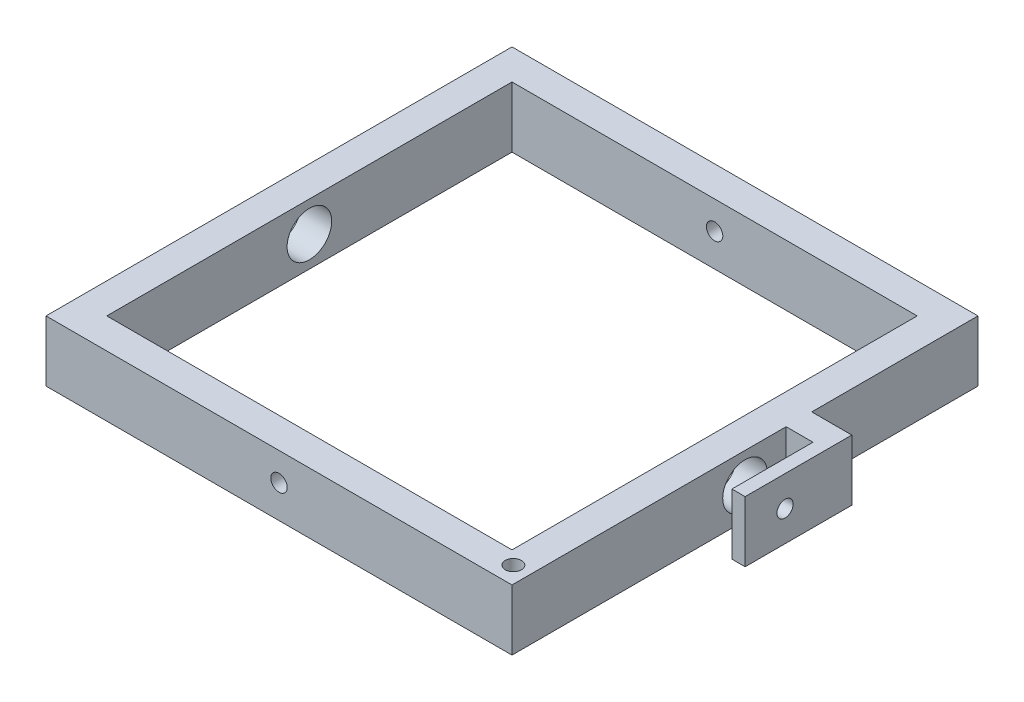
ISO-10303-21;
HEADER;
FILE_DESCRIPTION(('STEP AP214'),'2;1');
FILE_NAME('part.step','',(''),(''),'','','');
FILE_SCHEMA(('AUTOMOTIVE_DESIGN { 1 0 10303 214 1 1 1 1 }'));
ENDSEC;
DATA;
#1=APPLICATION_CONTEXT('core data for automotive mechanical design processes');
#2=APPLICATION_PROTOCOL_DEFINITION('international standard','automotive_design',2000,#1);
#3=PRODUCT_CONTEXT('',#1,'mechanical');
#4=PRODUCT('Part','Part','',(#3));
#5=PRODUCT_RELATED_PRODUCT_CATEGORY('part','',(#4));
#6=PRODUCT_DEFINITION_FORMATION('','',#4);
#7=PRODUCT_DEFINITION_CONTEXT('part definition',#1,'design');
#8=PRODUCT_DEFINITION('design','',#6,#7);
#9=PRODUCT_DEFINITION_SHAPE('','',#8);
#10=(LENGTH_UNIT() NAMED_UNIT(*) SI_UNIT(.MILLI.,.METRE.));
#11=(NAMED_UNIT(*) PLANE_ANGLE_UNIT() SI_UNIT($,.RADIAN.));
#12=(NAMED_UNIT(*) SI_UNIT($,.STERADIAN.) SOLID_ANGLE_UNIT());
#13=UNCERTAINTY_MEASURE_WITH_UNIT(LENGTH_MEASURE(1.E-05),#10,'distance_accuracy_value','');
#14=(GEOMETRIC_REPRESENTATION_CONTEXT(3) GLOBAL_UNCERTAINTY_ASSIGNED_CONTEXT((#13)) GLOBAL_UNIT_ASSIGNED_CONTEXT((#10,
#11,#12)) REPRESENTATION_CONTEXT('',''));
#15=CARTESIAN_POINT('',(0.,0.,0.));
#16=DIRECTION('',(0.,0.,1.));
#17=DIRECTION('',(1.,0.,0.));
#18=AXIS2_PLACEMENT_3D('',#15,#16,#17);
#19=CARTESIAN_POINT('',(0.,0.,-20.2865842487814));
#20=DIRECTION('',(0.,0.,1.));
#21=DIRECTION('',(1.,0.,0.));
#22=AXIS2_PLACEMENT_3D('',#19,#20,#21);
#23=PLANE('',#22);
#24=DIRECTION('',(1.,0.,0.));
#25=VECTOR('',#24,1.);
#26=CARTESIAN_POINT('',(115.,0.,-20.2865842487814));
#27=LINE('',#26,#25);
#28=CARTESIAN_POINT('',(115.,0.,-20.2865842487814));
#29=VERTEX_POINT('',#28);
#30=CARTESIAN_POINT('',(128.263720709924,0.,-20.2865842487814));
#31=VERTEX_POINT('',#30);
#32=EDGE_CURVE('E55',#29,#31,#27,.T.);
#33=ORIENTED_EDGE('',*,*,#32,.T.);
#34=DIRECTION('',(0.,-1.,0.));
#35=VECTOR('',#34,1.);
#36=CARTESIAN_POINT('',(128.263720709924,30.,-20.2865842487814));
#37=LINE('',#36,#35);
#38=CARTESIAN_POINT('',(128.263720709924,30.,-20.2865842487814));
#39=VERTEX_POINT('',#38);
#40=EDGE_CURVE('E50',#39,#31,#37,.T.);
#41=ORIENTED_EDGE('',*,*,#40,.F.);
#42=DIRECTION('',(-1.,0.,0.));
#43=VECTOR('',#42,1.);
#44=CARTESIAN_POINT('',(115.,30.,-20.2865842487814));
#45=LINE('',#44,#43);
#46=CARTESIAN_POINT('',(115.,30.,-20.2865842487814));
#47=VERTEX_POINT('',#46);
#48=EDGE_CURVE('E180',#39,#47,#45,.T.);
#49=ORIENTED_EDGE('',*,*,#48,.T.);
#50=DIRECTION('',(0.,-1.,0.));
#51=VECTOR('',#50,1.);
#52=CARTESIAN_POINT('',(115.,30.,-20.2865842487814));
#53=LINE('',#52,#51);
#54=EDGE_CURVE('E177',#47,#29,#53,.T.);
#55=ORIENTED_EDGE('',*,*,#54,.T.);
#56=EDGE_LOOP('',(#33,#41,#49,#55));
#57=FACE_BOUND('',#56,.T.);
#58=ADVANCED_FACE('F33',(#57),#23,.T.);
#59=CARTESIAN_POINT('',(115.,30.,115.));
#60=DIRECTION('',(-1.,0.,0.));
#61=DIRECTION('',(0.,0.,1.));
#62=AXIS2_PLACEMENT_3D('',#59,#60,#61);
#63=PLANE('',#62);
#64=DIRECTION('',(0.,0.,-1.));
#65=VECTOR('',#64,1.);
#66=CARTESIAN_POINT('',(115.,0.,115.));
#67=LINE('',#66,#65);
#68=CARTESIAN_POINT('',(115.,0.,115.));
#69=VERTEX_POINT('',#68);
#70=EDGE_CURVE('E252',#69,#29,#67,.T.);
#71=ORIENTED_EDGE('',*,*,#70,.T.);
#72=ORIENTED_EDGE('',*,*,#54,.F.);
#73=DIRECTION('',(0.,0.,-1.));
#74=VECTOR('',#73,1.);
#75=CARTESIAN_POINT('',(115.,30.,115.));
#76=LINE('',#75,#74);
#77=CARTESIAN_POINT('',(115.,30.,115.));
#78=VERTEX_POINT('',#77);
#79=EDGE_CURVE('E241',#78,#47,#76,.T.);
#80=ORIENTED_EDGE('',*,*,#79,.F.);
#81=DIRECTION('',(0.,-1.,0.));
#82=VECTOR('',#81,1.);
#83=CARTESIAN_POINT('',(115.,30.,115.));
#84=LINE('',#83,#82);
#85=EDGE_CURVE('E251',#78,#69,#84,.T.);
#86=ORIENTED_EDGE('',*,*,#85,.T.);
#87=EDGE_LOOP('',(#71,#72,#80,#86));
#88=FACE_BOUND('',#87,.T.);
#89=CARTESIAN_POINT('',(115.,15.,0.));
#90=DIRECTION('',(-1.,0.,0.));
#91=DIRECTION('',(0.,0.,1.));
#92=AXIS2_PLACEMENT_3D('',#89,#90,#91);
#93=CIRCLE('',#92,11.);
#94=CARTESIAN_POINT('',(115.,15.,11.));
#95=VERTEX_POINT('',#94);
#96=EDGE_CURVE('E182',#95,#95,#93,.T.);
#97=ORIENTED_EDGE('',*,*,#96,.T.);
#98=EDGE_LOOP('',(#97));
#99=FACE_BOUND('',#98,.T.);
#100=ADVANCED_FACE('F35',(#88,#99),#63,.F.);
#101=CARTESIAN_POINT('',(-91.0000000000001,15.,0.));
#102=DIRECTION('',(1.,0.,0.));
#103=DIRECTION('',(0.,0.,-1.));
#104=AXIS2_PLACEMENT_3D('',#101,#102,#103);
#105=CYLINDRICAL_SURFACE('',#104,11.);
#106=CARTESIAN_POINT('',(100.,15.,0.));
#107=DIRECTION('',(-1.,0.,0.));
#108=DIRECTION('',(0.,0.,1.));
#109=AXIS2_PLACEMENT_3D('',#106,#107,#108);
#110=CIRCLE('',#109,11.);
#111=CARTESIAN_POINT('',(100.,15.,11.));
#112=VERTEX_POINT('',#111);
#113=EDGE_CURVE('E208',#112,#112,#110,.T.);
#114=ORIENTED_EDGE('',*,*,#113,.T.);
#115=EDGE_LOOP('',(#114));
#116=FACE_BOUND('',#115,.T.);
#117=ORIENTED_EDGE('',*,*,#96,.F.);
#118=EDGE_LOOP('',(#117));
#119=FACE_BOUND('',#118,.T.);
#120=ADVANCED_FACE('F319',(#116,#119),#105,.F.);
#121=DIRECTION('',(0.,1.,0.));
#122=VECTOR('',#121,1.);
#123=CARTESIAN_POINT('',(115.,0.,-32.9349931006444));
#124=LINE('',#123,#122);
#125=CARTESIAN_POINT('',(115.,0.,-32.9349931006444));
#126=VERTEX_POINT('',#125);
#127=CARTESIAN_POINT('',(115.,30.,-32.9349931006444));
#128=VERTEX_POINT('',#127);
#129=EDGE_CURVE('E201',#126,#128,#124,.T.);
#130=ORIENTED_EDGE('',*,*,#129,.F.);
#131=CARTESIAN_POINT('',(115.,0.,-115.));
#132=VERTEX_POINT('',#131);
#133=EDGE_CURVE('E240',#126,#132,#67,.T.);
#134=ORIENTED_EDGE('',*,*,#133,.T.);
#135=DIRECTION('',(0.,-1.,0.));
#136=VECTOR('',#135,1.);
#137=CARTESIAN_POINT('',(115.,30.,-115.));
#138=LINE('',#137,#136);
#139=CARTESIAN_POINT('',(115.,30.,-115.));
#140=VERTEX_POINT('',#139);
#141=EDGE_CURVE('E11',#140,#132,#138,.T.);
#142=ORIENTED_EDGE('',*,*,#141,.F.);
#143=EDGE_CURVE('E245',#128,#140,#76,.T.);
#144=ORIENTED_EDGE('',*,*,#143,.F.);
#145=EDGE_LOOP('',(#130,#134,#142,#144));
#146=FACE_BOUND('',#145,.T.);
#147=ADVANCED_FACE('F321',(#146),#63,.F.);
#148=CARTESIAN_POINT('',(0.,30.,0.));
#149=DIRECTION('',(0.,-1.,0.));
#150=DIRECTION('',(0.,0.,-1.));
#151=AXIS2_PLACEMENT_3D('',#148,#149,#150);
#152=PLANE('',#151);
#153=CARTESIAN_POINT('',(106.851068212145,30.,106.177183029573));
#154=DIRECTION('',(0.,1.,0.));
#155=DIRECTION('',(0.,0.,1.));
#156=AXIS2_PLACEMENT_3D('',#153,#154,#155);
#157=CIRCLE('',#156,4.00000000000001);
#158=CARTESIAN_POINT('',(106.851068212145,30.,110.177183029573));
#159=VERTEX_POINT('',#158);
#160=EDGE_CURVE('E173',#159,#159,#157,.T.);
#161=ORIENTED_EDGE('',*,*,#160,.F.);
#162=EDGE_LOOP('',(#161));
#163=FACE_BOUND('',#162,.T.);
#164=ORIENTED_EDGE('',*,*,#48,.F.);
#165=DIRECTION('',(0.,0.,-1.));
#166=VECTOR('',#165,1.);
#167=CARTESIAN_POINT('',(128.263720709924,30.,19.7134157512186));
#168=LINE('',#167,#166);
#169=CARTESIAN_POINT('',(128.263720709924,30.,19.7134157512186));
#170=VERTEX_POINT('',#169);
#171=EDGE_CURVE('E145',#170,#39,#168,.T.);
#172=ORIENTED_EDGE('',*,*,#171,.F.);
#173=DIRECTION('',(-1.,0.,0.));
#174=VECTOR('',#173,1.);
#175=CARTESIAN_POINT('',(134.776160891981,30.,19.7134157512186));
#176=LINE('',#175,#174);
#177=CARTESIAN_POINT('',(134.776160891981,30.,19.7134157512186));
#178=VERTEX_POINT('',#177);
#179=EDGE_CURVE('E148',#178,#170,#176,.T.);
#180=ORIENTED_EDGE('',*,*,#179,.F.);
#181=DIRECTION('',(0.,0.,1.));
#182=VECTOR('',#181,1.);
#183=CARTESIAN_POINT('',(134.776160891981,30.,-43.2865842487814));
#184=LINE('',#183,#182);
#185=CARTESIAN_POINT('',(134.776160891981,30.,-32.9349931006444));
#186=VERTEX_POINT('',#185);
#187=EDGE_CURVE('E135',#186,#178,#184,.T.);
#188=ORIENTED_EDGE('',*,*,#187,.F.);
#189=DIRECTION('',(-1.,0.,0.));
#190=VECTOR('',#189,1.);
#191=CARTESIAN_POINT('',(143.,30.,-32.9349931006444));
#192=LINE('',#191,#190);
#193=EDGE_CURVE('E204',#186,#128,#192,.T.);
#194=ORIENTED_EDGE('',*,*,#193,.T.);
#195=ORIENTED_EDGE('',*,*,#143,.T.);
#196=DIRECTION('',(-1.,0.,0.));
#197=VECTOR('',#196,1.);
#198=CARTESIAN_POINT('',(-115.,30.,-115.));
#199=LINE('',#198,#197);
#200=CARTESIAN_POINT('',(-115.,30.,-115.));
#201=VERTEX_POINT('',#200);
#202=EDGE_CURVE('E244',#140,#201,#199,.T.);
#203=ORIENTED_EDGE('',*,*,#202,.T.);
#204=DIRECTION('',(0.,0.,1.));
#205=VECTOR('',#204,1.);
#206=CARTESIAN_POINT('',(-115.,30.,115.));
#207=LINE('',#206,#205);
#208=CARTESIAN_POINT('',(-115.,30.,115.));
#209=VERTEX_POINT('',#208);
#210=EDGE_CURVE('E247',#201,#209,#207,.T.);
#211=ORIENTED_EDGE('',*,*,#210,.T.);
#212=DIRECTION('',(1.,0.,0.));
#213=VECTOR('',#212,1.);
#214=CARTESIAN_POINT('',(-115.,30.,115.));
#215=LINE('',#214,#213);
#216=EDGE_CURVE('E249',#209,#78,#215,.T.);
#217=ORIENTED_EDGE('',*,*,#216,.T.);
#218=ORIENTED_EDGE('',*,*,#79,.T.);
#219=EDGE_LOOP('',(#164,#172,#180,#188,#194,#195,#203,#211,#217,#218));
#220=FACE_BOUND('',#219,.T.);
#221=DIRECTION('',(0.,0.,-1.));
#222=VECTOR('',#221,1.);
#223=CARTESIAN_POINT('',(100.,30.,100.));
#224=LINE('',#223,#222);
#225=CARTESIAN_POINT('',(100.,30.,100.));
#226=VERTEX_POINT('',#225);
#227=CARTESIAN_POINT('',(100.,30.,-100.));
#228=VERTEX_POINT('',#227);
#229=EDGE_CURVE('E209',#226,#228,#224,.T.);
#230=ORIENTED_EDGE('',*,*,#229,.F.);
#231=DIRECTION('',(1.,0.,0.));
#232=VECTOR('',#231,1.);
#233=CARTESIAN_POINT('',(-100.,30.,100.));
#234=LINE('',#233,#232);
#235=CARTESIAN_POINT('',(-100.,30.,100.));
#236=VERTEX_POINT('',#235);
#237=EDGE_CURVE('E217',#236,#226,#234,.T.);
#238=ORIENTED_EDGE('',*,*,#237,.F.);
#239=DIRECTION('',(0.,0.,1.));
#240=VECTOR('',#239,1.);
#241=CARTESIAN_POINT('',(-100.,30.,100.));
#242=LINE('',#241,#240);
#243=CARTESIAN_POINT('',(-100.,30.,-100.));
#244=VERTEX_POINT('',#243);
#245=EDGE_CURVE('E214',#244,#236,#242,.T.);
#246=ORIENTED_EDGE('',*,*,#245,.F.);
#247=DIRECTION('',(-1.,0.,0.));
#248=VECTOR('',#247,1.);
#249=CARTESIAN_POINT('',(-100.,30.,-100.));
#250=LINE('',#249,#248);
#251=EDGE_CURVE('E211',#228,#244,#250,.T.);
#252=ORIENTED_EDGE('',*,*,#251,.F.);
#253=EDGE_LOOP('',(#230,#238,#246,#252));
#254=FACE_BOUND('',#253,.T.);
#255=ADVANCED_FACE('F149',(#163,#220,#254),#152,.F.);
#256=CARTESIAN_POINT('',(0.,0.,0.));
#257=DIRECTION('',(0.,-1.,0.));
#258=DIRECTION('',(0.,0.,-1.));
#259=AXIS2_PLACEMENT_3D('',#256,#257,#258);
#260=PLANE('',#259);
#261=DIRECTION('',(0.,0.,1.));
#262=VECTOR('',#261,1.);
#263=CARTESIAN_POINT('',(134.776160891981,0.,-43.2865842487814));
#264=LINE('',#263,#262);
#265=CARTESIAN_POINT('',(134.776160891981,0.,-32.9349931006444));
#266=VERTEX_POINT('',#265);
#267=CARTESIAN_POINT('',(134.776160891981,0.,19.7134157512186));
#268=VERTEX_POINT('',#267);
#269=EDGE_CURVE('E144',#266,#268,#264,.T.);
#270=ORIENTED_EDGE('',*,*,#269,.T.);
#271=DIRECTION('',(1.,0.,0.));
#272=VECTOR('',#271,1.);
#273=CARTESIAN_POINT('',(134.776160891981,0.,19.7134157512186));
#274=LINE('',#273,#272);
#275=CARTESIAN_POINT('',(128.263720709924,0.,19.7134157512186));
#276=VERTEX_POINT('',#275);
#277=EDGE_CURVE('E159',#276,#268,#274,.T.);
#278=ORIENTED_EDGE('',*,*,#277,.F.);
#279=DIRECTION('',(0.,0.,-1.));
#280=VECTOR('',#279,1.);
#281=CARTESIAN_POINT('',(128.263720709924,0.,19.7134157512186));
#282=LINE('',#281,#280);
#283=EDGE_CURVE('E166',#276,#31,#282,.T.);
#284=ORIENTED_EDGE('',*,*,#283,.T.);
#285=ORIENTED_EDGE('',*,*,#32,.F.);
#286=ORIENTED_EDGE('',*,*,#70,.F.);
#287=DIRECTION('',(1.,0.,0.));
#288=VECTOR('',#287,1.);
#289=CARTESIAN_POINT('',(-115.,0.,115.));
#290=LINE('',#289,#288);
#291=CARTESIAN_POINT('',(-115.,0.,115.));
#292=VERTEX_POINT('',#291);
#293=EDGE_CURVE('E258',#292,#69,#290,.T.);
#294=ORIENTED_EDGE('',*,*,#293,.F.);
#295=DIRECTION('',(0.,0.,1.));
#296=VECTOR('',#295,1.);
#297=CARTESIAN_POINT('',(-115.,0.,115.));
#298=LINE('',#297,#296);
#299=CARTESIAN_POINT('',(-115.,0.,-115.));
#300=VERTEX_POINT('',#299);
#301=EDGE_CURVE('E256',#300,#292,#298,.T.);
#302=ORIENTED_EDGE('',*,*,#301,.F.);
#303=DIRECTION('',(-1.,0.,0.));
#304=VECTOR('',#303,1.);
#305=CARTESIAN_POINT('',(-115.,0.,-115.));
#306=LINE('',#305,#304);
#307=EDGE_CURVE('E254',#132,#300,#306,.T.);
#308=ORIENTED_EDGE('',*,*,#307,.F.);
#309=ORIENTED_EDGE('',*,*,#133,.F.);
#310=DIRECTION('',(-1.,0.,0.));
#311=VECTOR('',#310,1.);
#312=CARTESIAN_POINT('',(143.,0.,-32.9349931006444));
#313=LINE('',#312,#311);
#314=EDGE_CURVE('E206',#266,#126,#313,.T.);
#315=ORIENTED_EDGE('',*,*,#314,.F.);
#316=EDGE_LOOP('',(#270,#278,#284,#285,#286,#294,#302,#308,#309,#315));
#317=FACE_BOUND('',#316,.T.);
#318=CARTESIAN_POINT('',(106.851068212145,0.,106.177183029573));
#319=DIRECTION('',(0.,-1.,0.));
#320=DIRECTION('',(0.,0.,-1.));
#321=AXIS2_PLACEMENT_3D('',#318,#319,#320);
#322=CIRCLE('',#321,4.00000000000001);
#323=CARTESIAN_POINT('',(106.851068212145,0.,102.177183029573));
#324=VERTEX_POINT('',#323);
#325=EDGE_CURVE('E176',#324,#324,#322,.T.);
#326=ORIENTED_EDGE('',*,*,#325,.F.);
#327=EDGE_LOOP('',(#326));
#328=FACE_BOUND('',#327,.T.);
#329=DIRECTION('',(1.,0.,0.));
#330=VECTOR('',#329,1.);
#331=CARTESIAN_POINT('',(-100.,0.,100.));
#332=LINE('',#331,#330);
#333=CARTESIAN_POINT('',(-100.,0.,100.));
#334=VERTEX_POINT('',#333);
#335=CARTESIAN_POINT('',(100.,0.,100.));
#336=VERTEX_POINT('',#335);
#337=EDGE_CURVE('E212',#334,#336,#332,.T.);
#338=ORIENTED_EDGE('',*,*,#337,.T.);
#339=DIRECTION('',(0.,0.,-1.));
#340=VECTOR('',#339,1.);
#341=CARTESIAN_POINT('',(100.,0.,100.));
#342=LINE('',#341,#340);
#343=CARTESIAN_POINT('',(100.,0.,-100.));
#344=VERTEX_POINT('',#343);
#345=EDGE_CURVE('E220',#336,#344,#342,.T.);
#346=ORIENTED_EDGE('',*,*,#345,.T.);
#347=DIRECTION('',(-1.,0.,0.));
#348=VECTOR('',#347,1.);
#349=CARTESIAN_POINT('',(-100.,0.,-100.));
#350=LINE('',#349,#348);
#351=CARTESIAN_POINT('',(-100.,0.,-100.));
#352=VERTEX_POINT('',#351);
#353=EDGE_CURVE('E223',#344,#352,#350,.T.);
#354=ORIENTED_EDGE('',*,*,#353,.T.);
#355=DIRECTION('',(0.,0.,1.));
#356=VECTOR('',#355,1.);
#357=CARTESIAN_POINT('',(-100.,0.,100.));
#358=LINE('',#357,#356);
#359=EDGE_CURVE('E226',#352,#334,#358,.T.);
#360=ORIENTED_EDGE('',*,*,#359,.T.);
#361=EDGE_LOOP('',(#338,#346,#354,#360));
#362=FACE_BOUND('',#361,.T.);
#363=ADVANCED_FACE('F276',(#317,#328,#362),#260,.T.);
#364=CARTESIAN_POINT('',(-115.,30.,-115.));
#365=DIRECTION('',(0.,0.,1.));
#366=DIRECTION('',(1.,0.,0.));
#367=AXIS2_PLACEMENT_3D('',#364,#365,#366);
#368=PLANE('',#367);
#369=CARTESIAN_POINT('',(0.,16.1759191137221,-115.));
#370=DIRECTION('',(0.,0.,1.));
#371=DIRECTION('',(1.,0.,0.));
#372=AXIS2_PLACEMENT_3D('',#369,#370,#371);
#373=CIRCLE('',#372,4.04669054587853);
#374=CARTESIAN_POINT('',(4.04669054587853,16.1759191137221,-115.));
#375=VERTEX_POINT('',#374);
#376=EDGE_CURVE('E198',#375,#375,#373,.T.);
#377=ORIENTED_EDGE('',*,*,#376,.T.);
#378=EDGE_LOOP('',(#377));
#379=FACE_BOUND('',#378,.T.);
#380=ORIENTED_EDGE('',*,*,#307,.T.);
#381=DIRECTION('',(0.,-1.,0.));
#382=VECTOR('',#381,1.);
#383=CARTESIAN_POINT('',(-115.,30.,-115.));
#384=LINE('',#383,#382);
#385=EDGE_CURVE('E42',#201,#300,#384,.T.);
#386=ORIENTED_EDGE('',*,*,#385,.F.);
#387=ORIENTED_EDGE('',*,*,#202,.F.);
#388=ORIENTED_EDGE('',*,*,#141,.T.);
#389=EDGE_LOOP('',(#380,#386,#387,#388));
#390=FACE_BOUND('',#389,.T.);
#391=ADVANCED_FACE('F279',(#379,#390),#368,.F.);
#392=CARTESIAN_POINT('',(-115.,30.,115.));
#393=DIRECTION('',(1.,0.,0.));
#394=DIRECTION('',(0.,0.,-1.));
#395=AXIS2_PLACEMENT_3D('',#392,#393,#394);
#396=PLANE('',#395);
#397=CARTESIAN_POINT('',(-115.,15.,0.));
#398=DIRECTION('',(-1.,0.,0.));
#399=DIRECTION('',(0.,0.,1.));
#400=AXIS2_PLACEMENT_3D('',#397,#398,#399);
#401=CIRCLE('',#400,11.);
#402=CARTESIAN_POINT('',(-115.,15.,11.));
#403=VERTEX_POINT('',#402);
#404=EDGE_CURVE('E185',#403,#403,#401,.T.);
#405=ORIENTED_EDGE('',*,*,#404,.F.);
#406=EDGE_LOOP('',(#405));
#407=FACE_BOUND('',#406,.T.);
#408=ORIENTED_EDGE('',*,*,#301,.T.);
#409=DIRECTION('',(0.,-1.,0.));
#410=VECTOR('',#409,1.);
#411=CARTESIAN_POINT('',(-115.,30.,115.));
#412=LINE('',#411,#410);
#413=EDGE_CURVE('E262',#209,#292,#412,.T.);
#414=ORIENTED_EDGE('',*,*,#413,.F.);
#415=ORIENTED_EDGE('',*,*,#210,.F.);
#416=ORIENTED_EDGE('',*,*,#385,.T.);
#417=EDGE_LOOP('',(#408,#414,#415,#416));
#418=FACE_BOUND('',#417,.T.);
#419=ADVANCED_FACE('F353',(#407,#418),#396,.F.);
#420=CARTESIAN_POINT('',(-115.,30.,115.));
#421=DIRECTION('',(0.,0.,-1.));
#422=DIRECTION('',(-1.,0.,0.));
#423=AXIS2_PLACEMENT_3D('',#420,#421,#422);
#424=PLANE('',#423);
#425=CARTESIAN_POINT('',(0.,16.1759191137221,115.));
#426=DIRECTION('',(0.,0.,1.));
#427=DIRECTION('',(1.,0.,0.));
#428=AXIS2_PLACEMENT_3D('',#425,#426,#427);
#429=CIRCLE('',#428,4.04669054587853);
#430=CARTESIAN_POINT('',(4.04669054587853,16.1759191137221,115.));
#431=VERTEX_POINT('',#430);
#432=EDGE_CURVE('E191',#431,#431,#429,.T.);
#433=ORIENTED_EDGE('',*,*,#432,.F.);
#434=EDGE_LOOP('',(#433));
#435=FACE_BOUND('',#434,.T.);
#436=ORIENTED_EDGE('',*,*,#293,.T.);
#437=ORIENTED_EDGE('',*,*,#85,.F.);
#438=ORIENTED_EDGE('',*,*,#216,.F.);
#439=ORIENTED_EDGE('',*,*,#413,.T.);
#440=EDGE_LOOP('',(#436,#437,#438,#439));
#441=FACE_BOUND('',#440,.T.);
#442=ADVANCED_FACE('F348',(#435,#441),#424,.F.);
#443=CARTESIAN_POINT('',(100.,30.,100.));
#444=DIRECTION('',(-1.,0.,0.));
#445=DIRECTION('',(0.,0.,1.));
#446=AXIS2_PLACEMENT_3D('',#443,#444,#445);
#447=PLANE('',#446);
#448=ORIENTED_EDGE('',*,*,#113,.F.);
#449=EDGE_LOOP('',(#448));
#450=FACE_BOUND('',#449,.T.);
#451=ORIENTED_EDGE('',*,*,#345,.F.);
#452=DIRECTION('',(0.,-1.,0.));
#453=VECTOR('',#452,1.);
#454=CARTESIAN_POINT('',(100.,30.,100.));
#455=LINE('',#454,#453);
#456=EDGE_CURVE('E219',#226,#336,#455,.T.);
#457=ORIENTED_EDGE('',*,*,#456,.F.);
#458=ORIENTED_EDGE('',*,*,#229,.T.);
#459=DIRECTION('',(0.,-1.,0.));
#460=VECTOR('',#459,1.);
#461=CARTESIAN_POINT('',(100.,30.,-100.));
#462=LINE('',#461,#460);
#463=EDGE_CURVE('E237',#228,#344,#462,.T.);
#464=ORIENTED_EDGE('',*,*,#463,.T.);
#465=EDGE_LOOP('',(#451,#457,#458,#464));
#466=FACE_BOUND('',#465,.T.);
#467=ADVANCED_FACE('F290',(#450,#466),#447,.T.);
#468=CARTESIAN_POINT('',(-100.,30.,-100.));
#469=DIRECTION('',(0.,0.,1.));
#470=DIRECTION('',(1.,0.,0.));
#471=AXIS2_PLACEMENT_3D('',#468,#469,#470);
#472=PLANE('',#471);
#473=CARTESIAN_POINT('',(0.,16.1759191137221,-100.));
#474=DIRECTION('',(0.,0.,1.));
#475=DIRECTION('',(1.,0.,0.));
#476=AXIS2_PLACEMENT_3D('',#473,#474,#475);
#477=CIRCLE('',#476,4.04669054587853);
#478=CARTESIAN_POINT('',(4.04669054587853,16.1759191137221,-100.));
#479=VERTEX_POINT('',#478);
#480=EDGE_CURVE('E195',#479,#479,#477,.T.);
#481=ORIENTED_EDGE('',*,*,#480,.F.);
#482=EDGE_LOOP('',(#481));
#483=FACE_BOUND('',#482,.T.);
#484=ORIENTED_EDGE('',*,*,#353,.F.);
#485=ORIENTED_EDGE('',*,*,#463,.F.);
#486=ORIENTED_EDGE('',*,*,#251,.T.);
#487=DIRECTION('',(0.,-1.,0.));
#488=VECTOR('',#487,1.);
#489=CARTESIAN_POINT('',(-100.,30.,-100.));
#490=LINE('',#489,#488);
#491=EDGE_CURVE('E235',#244,#352,#490,.T.);
#492=ORIENTED_EDGE('',*,*,#491,.T.);
#493=EDGE_LOOP('',(#484,#485,#486,#492));
#494=FACE_BOUND('',#493,.T.);
#495=ADVANCED_FACE('F296',(#483,#494),#472,.T.);
#496=CARTESIAN_POINT('',(-100.,30.,100.));
#497=DIRECTION('',(1.,0.,0.));
#498=DIRECTION('',(0.,0.,-1.));
#499=AXIS2_PLACEMENT_3D('',#496,#497,#498);
#500=PLANE('',#499);
#501=CARTESIAN_POINT('',(-100.,15.,0.));
#502=DIRECTION('',(1.,0.,0.));
#503=DIRECTION('',(0.,0.,-1.));
#504=AXIS2_PLACEMENT_3D('',#501,#502,#503);
#505=CIRCLE('',#504,11.);
#506=CARTESIAN_POINT('',(-100.,15.,11.));
#507=VERTEX_POINT('',#506);
#508=EDGE_CURVE('E188',#507,#507,#505,.T.);
#509=ORIENTED_EDGE('',*,*,#508,.F.);
#510=EDGE_LOOP('',(#509));
#511=FACE_BOUND('',#510,.T.);
#512=ORIENTED_EDGE('',*,*,#359,.F.);
#513=ORIENTED_EDGE('',*,*,#491,.F.);
#514=ORIENTED_EDGE('',*,*,#245,.T.);
#515=DIRECTION('',(0.,-1.,0.));
#516=VECTOR('',#515,1.);
#517=CARTESIAN_POINT('',(-100.,30.,100.));
#518=LINE('',#517,#516);
#519=EDGE_CURVE('E233',#236,#334,#518,.T.);
#520=ORIENTED_EDGE('',*,*,#519,.T.);
#521=EDGE_LOOP('',(#512,#513,#514,#520));
#522=FACE_BOUND('',#521,.T.);
#523=ADVANCED_FACE('F298',(#511,#522),#500,.T.);
#524=CARTESIAN_POINT('',(-100.,30.,100.));
#525=DIRECTION('',(0.,0.,-1.));
#526=DIRECTION('',(-1.,0.,0.));
#527=AXIS2_PLACEMENT_3D('',#524,#525,#526);
#528=PLANE('',#527);
#529=CARTESIAN_POINT('',(0.,16.1759191137221,100.));
#530=DIRECTION('',(0.,0.,-1.));
#531=DIRECTION('',(-1.,0.,0.));
#532=AXIS2_PLACEMENT_3D('',#529,#530,#531);
#533=CIRCLE('',#532,4.04669054587853);
#534=CARTESIAN_POINT('',(-4.04669054587853,16.1759191137221,100.));
#535=VERTEX_POINT('',#534);
#536=EDGE_CURVE('E194',#535,#535,#533,.T.);
#537=ORIENTED_EDGE('',*,*,#536,.F.);
#538=EDGE_LOOP('',(#537));
#539=FACE_BOUND('',#538,.T.);
#540=ORIENTED_EDGE('',*,*,#337,.F.);
#541=ORIENTED_EDGE('',*,*,#519,.F.);
#542=ORIENTED_EDGE('',*,*,#237,.T.);
#543=ORIENTED_EDGE('',*,*,#456,.T.);
#544=EDGE_LOOP('',(#540,#541,#542,#543));
#545=FACE_BOUND('',#544,.T.);
#546=ADVANCED_FACE('F285',(#539,#545),#528,.T.);
#547=CARTESIAN_POINT('',(143.,0.,-32.9349931006444));
#548=DIRECTION('',(0.,0.,1.));
#549=DIRECTION('',(1.,0.,0.));
#550=AXIS2_PLACEMENT_3D('',#547,#548,#549);
#551=PLANE('',#550);
#552=ORIENTED_EDGE('',*,*,#193,.F.);
#553=DIRECTION('',(0.,-1.,0.));
#554=VECTOR('',#553,1.);
#555=CARTESIAN_POINT('',(134.776160891981,0.,-32.9349931006444));
#556=LINE('',#555,#554);
#557=EDGE_CURVE('E141',#186,#266,#556,.T.);
#558=ORIENTED_EDGE('',*,*,#557,.T.);
#559=ORIENTED_EDGE('',*,*,#314,.T.);
#560=ORIENTED_EDGE('',*,*,#129,.T.);
#561=EDGE_LOOP('',(#552,#558,#559,#560));
#562=FACE_BOUND('',#561,.T.);
#563=ADVANCED_FACE('F306',(#562),#551,.F.);
#564=CARTESIAN_POINT('',(0.,16.1759191137221,-165.));
#565=DIRECTION('',(0.,0.,1.));
#566=DIRECTION('',(1.,0.,0.));
#567=AXIS2_PLACEMENT_3D('',#564,#565,#566);
#568=CYLINDRICAL_SURFACE('',#567,4.04669054587853);
#569=ORIENTED_EDGE('',*,*,#536,.T.);
#570=EDGE_LOOP('',(#569));
#571=FACE_BOUND('',#570,.T.);
#572=ORIENTED_EDGE('',*,*,#432,.T.);
#573=EDGE_LOOP('',(#572));
#574=FACE_BOUND('',#573,.T.);
#575=ADVANCED_FACE('F330',(#571,#574),#568,.F.);
#576=ORIENTED_EDGE('',*,*,#480,.T.);
#577=EDGE_LOOP('',(#576));
#578=FACE_BOUND('',#577,.T.);
#579=ORIENTED_EDGE('',*,*,#376,.F.);
#580=EDGE_LOOP('',(#579));
#581=FACE_BOUND('',#580,.T.);
#582=ADVANCED_FACE('F328',(#578,#581),#568,.F.);
#583=CARTESIAN_POINT('',(115.,15.,0.));
#584=DIRECTION('',(-1.,0.,0.));
#585=DIRECTION('',(0.,0.,1.));
#586=AXIS2_PLACEMENT_3D('',#583,#584,#585);
#587=CYLINDRICAL_SURFACE('',#586,11.);
#588=CARTESIAN_POINT('',(-100.,15.,11.));
#589=CARTESIAN_POINT('',(-100.15625,15.,11.));
#590=CARTESIAN_POINT('',(-100.3125,15.,11.));
#591=CARTESIAN_POINT('',(-100.625,15.,11.));
#592=CARTESIAN_POINT('',(-100.78125,15.,11.));
#593=CARTESIAN_POINT('',(-101.09375,15.,11.));
#594=CARTESIAN_POINT('',(-101.25,15.,11.));
#595=CARTESIAN_POINT('',(-101.5625,15.,11.));
#596=CARTESIAN_POINT('',(-101.71875,15.,11.));
#597=CARTESIAN_POINT('',(-102.03125,15.,11.));
#598=CARTESIAN_POINT('',(-102.1875,15.,11.));
#599=CARTESIAN_POINT('',(-102.5,15.,11.));
#600=CARTESIAN_POINT('',(-102.65625,15.,11.));
#601=CARTESIAN_POINT('',(-102.96875,15.,11.));
#602=CARTESIAN_POINT('',(-103.125,15.,11.));
#603=CARTESIAN_POINT('',(-103.4375,15.,11.));
#604=CARTESIAN_POINT('',(-103.59375,15.,11.));
#605=CARTESIAN_POINT('',(-103.90625,15.,11.));
#606=CARTESIAN_POINT('',(-104.0625,15.,11.));
#607=CARTESIAN_POINT('',(-104.375,15.,11.));
#608=CARTESIAN_POINT('',(-104.53125,15.,11.));
#609=CARTESIAN_POINT('',(-104.84375,15.,11.));
#610=CARTESIAN_POINT('',(-105.,15.,11.));
#611=CARTESIAN_POINT('',(-105.3125,15.,11.));
#612=CARTESIAN_POINT('',(-105.46875,15.,11.));
#613=CARTESIAN_POINT('',(-105.78125,15.,11.));
#614=CARTESIAN_POINT('',(-105.9375,15.,11.));
#615=CARTESIAN_POINT('',(-106.25,15.,11.));
#616=CARTESIAN_POINT('',(-106.40625,15.,11.));
#617=CARTESIAN_POINT('',(-106.71875,15.,11.));
#618=CARTESIAN_POINT('',(-106.875,15.,11.));
#619=CARTESIAN_POINT('',(-107.1875,15.,11.));
#620=CARTESIAN_POINT('',(-107.34375,15.,11.));
#621=CARTESIAN_POINT('',(-107.65625,15.,11.));
#622=CARTESIAN_POINT('',(-107.8125,15.,11.));
#623=CARTESIAN_POINT('',(-108.125,15.,11.));
#624=CARTESIAN_POINT('',(-108.28125,15.,11.));
#625=CARTESIAN_POINT('',(-108.59375,15.,11.));
#626=CARTESIAN_POINT('',(-108.75,15.,11.));
#627=CARTESIAN_POINT('',(-109.0625,15.,11.));
#628=CARTESIAN_POINT('',(-109.21875,15.,11.));
#629=CARTESIAN_POINT('',(-109.53125,15.,11.));
#630=CARTESIAN_POINT('',(-109.6875,15.,11.));
#631=CARTESIAN_POINT('',(-110.,15.,11.));
#632=CARTESIAN_POINT('',(-110.15625,15.,11.));
#633=CARTESIAN_POINT('',(-110.46875,15.,11.));
#634=CARTESIAN_POINT('',(-110.625,15.,11.));
#635=CARTESIAN_POINT('',(-110.9375,15.,11.));
#636=CARTESIAN_POINT('',(-111.09375,15.,11.));
#637=CARTESIAN_POINT('',(-111.40625,15.,11.));
#638=CARTESIAN_POINT('',(-111.5625,15.,11.));
#639=CARTESIAN_POINT('',(-111.875,15.,11.));
#640=CARTESIAN_POINT('',(-112.03125,15.,11.));
#641=CARTESIAN_POINT('',(-112.34375,15.,11.));
#642=CARTESIAN_POINT('',(-112.5,15.,11.));
#643=CARTESIAN_POINT('',(-112.8125,15.,11.));
#644=CARTESIAN_POINT('',(-112.96875,15.,11.));
#645=CARTESIAN_POINT('',(-113.28125,15.,11.));
#646=CARTESIAN_POINT('',(-113.4375,15.,11.));
#647=CARTESIAN_POINT('',(-113.75,15.,11.));
#648=CARTESIAN_POINT('',(-113.90625,15.,11.));
#649=CARTESIAN_POINT('',(-114.21875,15.,11.));
#650=CARTESIAN_POINT('',(-114.375,15.,11.));
#651=CARTESIAN_POINT('',(-114.6875,15.,11.));
#652=CARTESIAN_POINT('',(-114.84375,15.,11.));
#653=CARTESIAN_POINT('',(-115.,15.,11.));
#654=B_SPLINE_CURVE_WITH_KNOTS('',3,(#588,#589,#590,#591,#592,#593,#594,#595,#596,#597,#598,
#599,#600,#601,#602,#603,#604,#605,#606,#607,#608,#609,#610,#611,#612,#613,#614,#615,#616,#617,
#618,#619,#620,#621,#622,#623,#624,#625,#626,#627,#628,#629,#630,#631,#632,#633,#634,#635,#636,
#637,#638,#639,#640,#641,#642,#643,#644,#645,#646,#647,#648,#649,#650,#651,#652,#653),
.UNSPECIFIED.,.F.,.F.,(4,2,2,2,2,2,2,2,2,2,2,2,2,2,2,2,2,2,2,2,2,2,2,2,2,2,2,2,2,2,2,2,4),(0.,
0.46874999999999,0.937500000000008,1.40625,1.87499999999999,2.34375000000001,2.8125,
3.28124999999999,3.74999999999998,4.21874999999999,4.68749999999998,5.15624999999997,
5.62499999999999,6.09374999999998,6.56249999999997,7.03124999999999,7.49999999999998,
7.96874999999997,8.43749999999999,8.90624999999998,9.37499999999997,9.84374999999998,10.3125,
10.78125,11.25,11.71875,12.1875,12.65625,13.125,13.59375,14.0625,14.53125,15.),.UNSPECIFIED.);
#655=EDGE_CURVE('BSEAM325',#507,#403,#654,.T.);
#656=ORIENTED_EDGE('',*,*,#508,.T.);
#657=ORIENTED_EDGE('',*,*,#404,.T.);
#658=ORIENTED_EDGE('',*,*,#655,.T.);
#659=ORIENTED_EDGE('',*,*,#655,.F.);
#660=EDGE_LOOP('',(#656,#658,#657,#659));
#661=FACE_BOUND('',#660,.T.);
#662=ADVANCED_FACE('F325',(#661),#587,.F.);
#663=CARTESIAN_POINT('',(106.851068212145,-234.,106.177183029573));
#664=DIRECTION('',(0.,1.,0.));
#665=DIRECTION('',(0.,0.,1.));
#666=AXIS2_PLACEMENT_3D('',#663,#664,#665);
#667=CYLINDRICAL_SURFACE('',#666,4.00000000000001);
#668=ORIENTED_EDGE('',*,*,#325,.T.);
#669=EDGE_LOOP('',(#668));
#670=FACE_BOUND('',#669,.T.);
#671=ORIENTED_EDGE('',*,*,#160,.T.);
#672=EDGE_LOOP('',(#671));
#673=FACE_BOUND('',#672,.T.);
#674=ADVANCED_FACE('F273',(#670,#673),#667,.F.);
#675=CARTESIAN_POINT('',(134.776160891981,30.,-43.2865842487814));
#676=DIRECTION('',(-1.,0.,0.));
#677=DIRECTION('',(0.,0.,1.));
#678=AXIS2_PLACEMENT_3D('',#675,#676,#677);
#679=PLANE('',#678);
#680=CARTESIAN_POINT('',(134.776160891981,15.,0.));
#681=DIRECTION('',(-1.,0.,0.));
#682=DIRECTION('',(0.,0.,1.));
#683=AXIS2_PLACEMENT_3D('',#680,#681,#682);
#684=CIRCLE('',#683,4.);
#685=CARTESIAN_POINT('',(134.776160891981,15.,4.));
#686=VERTEX_POINT('',#685);
#687=EDGE_CURVE('E161',#686,#686,#684,.T.);
#688=ORIENTED_EDGE('',*,*,#687,.T.);
#689=EDGE_LOOP('',(#688));
#690=FACE_BOUND('',#689,.T.);
#691=ORIENTED_EDGE('',*,*,#187,.T.);
#692=DIRECTION('',(0.,1.,0.));
#693=VECTOR('',#692,1.);
#694=CARTESIAN_POINT('',(134.776160891981,30.,19.7134157512186));
#695=LINE('',#694,#693);
#696=EDGE_CURVE('E139',#268,#178,#695,.T.);
#697=ORIENTED_EDGE('',*,*,#696,.F.);
#698=ORIENTED_EDGE('',*,*,#269,.F.);
#699=ORIENTED_EDGE('',*,*,#557,.F.);
#700=EDGE_LOOP('',(#691,#697,#698,#699));
#701=FACE_BOUND('',#700,.T.);
#702=ADVANCED_FACE('F137',(#690,#701),#679,.F.);
#703=CARTESIAN_POINT('',(128.263720709924,30.,19.7134157512186));
#704=DIRECTION('',(1.,0.,0.));
#705=DIRECTION('',(0.,0.,-1.));
#706=AXIS2_PLACEMENT_3D('',#703,#704,#705);
#707=PLANE('',#706);
#708=CARTESIAN_POINT('',(128.263720709924,15.,0.));
#709=DIRECTION('',(1.,0.,0.));
#710=DIRECTION('',(0.,0.,-1.));
#711=AXIS2_PLACEMENT_3D('',#708,#709,#710);
#712=CIRCLE('',#711,4.);
#713=CARTESIAN_POINT('',(128.263720709924,15.,-4.));
#714=VERTEX_POINT('',#713);
#715=EDGE_CURVE('E37',#714,#714,#712,.T.);
#716=ORIENTED_EDGE('',*,*,#715,.T.);
#717=EDGE_LOOP('',(#716));
#718=FACE_BOUND('',#717,.T.);
#719=ORIENTED_EDGE('',*,*,#40,.T.);
#720=ORIENTED_EDGE('',*,*,#283,.F.);
#721=DIRECTION('',(0.,-1.,0.));
#722=VECTOR('',#721,1.);
#723=CARTESIAN_POINT('',(128.263720709924,30.,19.7134157512186));
#724=LINE('',#723,#722);
#725=EDGE_CURVE('E154',#170,#276,#724,.T.);
#726=ORIENTED_EDGE('',*,*,#725,.F.);
#727=ORIENTED_EDGE('',*,*,#171,.T.);
#728=EDGE_LOOP('',(#719,#720,#726,#727));
#729=FACE_BOUND('',#728,.T.);
#730=ADVANCED_FACE('F389',(#718,#729),#707,.F.);
#731=CARTESIAN_POINT('',(0.,0.,19.7134157512186));
#732=DIRECTION('',(0.,0.,-1.));
#733=DIRECTION('',(-1.,0.,0.));
#734=AXIS2_PLACEMENT_3D('',#731,#732,#733);
#735=PLANE('',#734);
#736=ORIENTED_EDGE('',*,*,#696,.T.);
#737=ORIENTED_EDGE('',*,*,#179,.T.);
#738=ORIENTED_EDGE('',*,*,#725,.T.);
#739=ORIENTED_EDGE('',*,*,#277,.T.);
#740=EDGE_LOOP('',(#736,#737,#738,#739));
#741=FACE_BOUND('',#740,.T.);
#742=ADVANCED_FACE('F157',(#741),#735,.F.);
#743=CARTESIAN_POINT('',(161.,15.,0.));
#744=DIRECTION('',(-1.,0.,0.));
#745=DIRECTION('',(0.,0.,1.));
#746=AXIS2_PLACEMENT_3D('',#743,#744,#745);
#747=CYLINDRICAL_SURFACE('',#746,4.);
#748=ORIENTED_EDGE('',*,*,#715,.F.);
#749=EDGE_LOOP('',(#748));
#750=FACE_BOUND('',#749,.T.);
#751=ORIENTED_EDGE('',*,*,#687,.F.);
#752=EDGE_LOOP('',(#751));
#753=FACE_BOUND('',#752,.T.);
#754=ADVANCED_FACE('F397',(#750,#753),#747,.F.);
#755=CLOSED_SHELL('',(#58,#100,#120,#147,#255,#363,#391,#419,#442,#467,#495,#523,#546,#563,#575,
#582,#662,#674,#702,#730,#742,#754));
#756=MANIFOLD_SOLID_BREP('B2',#755);
#757=ADVANCED_BREP_SHAPE_REPRESENTATION('',(#18,#756),#14);
#758=SHAPE_DEFINITION_REPRESENTATION(#9,#757);
ENDSEC;
END-ISO-10303-21;
